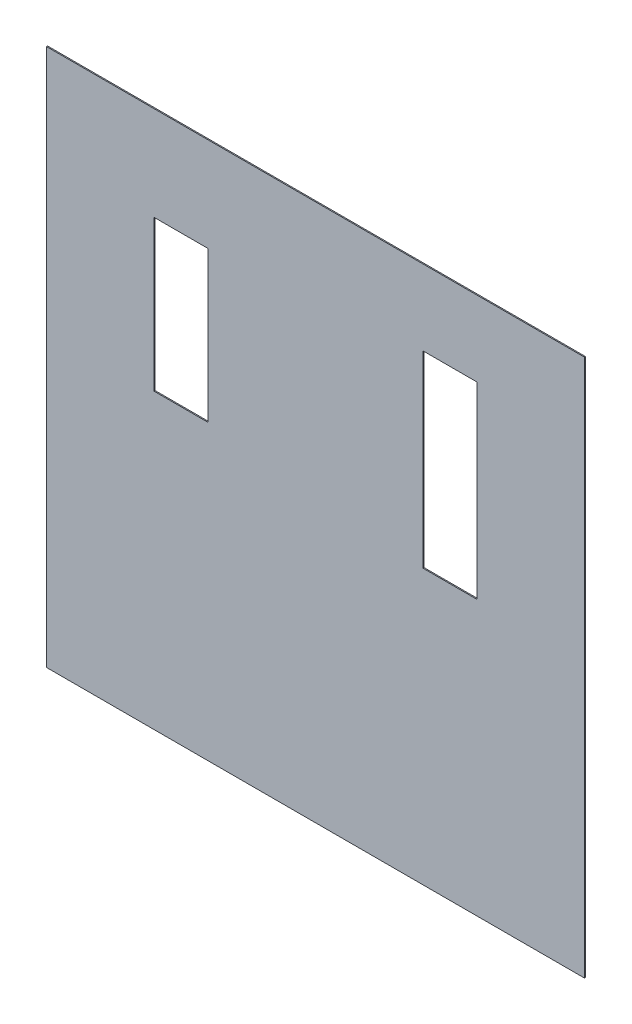
ISO-10303-21;
HEADER;
FILE_DESCRIPTION(('STEP AP214'),'2;1');
FILE_NAME('part.step','',(''),(''),'','','');
FILE_SCHEMA(('AUTOMOTIVE_DESIGN { 1 0 10303 214 1 1 1 1 }'));
ENDSEC;
DATA;
#1=APPLICATION_CONTEXT('core data for automotive mechanical design processes');
#2=APPLICATION_PROTOCOL_DEFINITION('international standard','automotive_design',2000,#1);
#3=PRODUCT_CONTEXT('',#1,'mechanical');
#4=PRODUCT('Part','Part','',(#3));
#5=PRODUCT_RELATED_PRODUCT_CATEGORY('part','',(#4));
#6=PRODUCT_DEFINITION_FORMATION('','',#4);
#7=PRODUCT_DEFINITION_CONTEXT('part definition',#1,'design');
#8=PRODUCT_DEFINITION('design','',#6,#7);
#9=PRODUCT_DEFINITION_SHAPE('','',#8);
#10=(LENGTH_UNIT() NAMED_UNIT(*) SI_UNIT(.MILLI.,.METRE.));
#11=(NAMED_UNIT(*) PLANE_ANGLE_UNIT() SI_UNIT($,.RADIAN.));
#12=(NAMED_UNIT(*) SI_UNIT($,.STERADIAN.) SOLID_ANGLE_UNIT());
#13=UNCERTAINTY_MEASURE_WITH_UNIT(LENGTH_MEASURE(1.E-05),#10,'distance_accuracy_value','');
#14=(GEOMETRIC_REPRESENTATION_CONTEXT(3) GLOBAL_UNCERTAINTY_ASSIGNED_CONTEXT((#13)) GLOBAL_UNIT_ASSIGNED_CONTEXT((#10,
#11,#12)) REPRESENTATION_CONTEXT('',''));
#15=CARTESIAN_POINT('',(0.,0.,0.));
#16=DIRECTION('',(0.,0.,1.));
#17=DIRECTION('',(1.,0.,0.));
#18=AXIS2_PLACEMENT_3D('',#15,#16,#17);
#19=CARTESIAN_POINT('',(0.,0.,0.0508));
#20=DIRECTION('',(1.,0.,0.));
#21=DIRECTION('',(0.,0.,-1.));
#22=AXIS2_PLACEMENT_3D('',#19,#20,#21);
#23=PLANE('',#22);
#24=DIRECTION('',(0.,-1.,0.));
#25=VECTOR('',#24,1.);
#26=CARTESIAN_POINT('',(0.,0.,0.));
#27=LINE('',#26,#25);
#28=CARTESIAN_POINT('',(0.,25.4,0.));
#29=VERTEX_POINT('',#28);
#30=CARTESIAN_POINT('',(0.,0.,0.));
#31=VERTEX_POINT('',#30);
#32=EDGE_CURVE('E183',#29,#31,#27,.T.);
#33=ORIENTED_EDGE('',*,*,#32,.T.);
#34=DIRECTION('',(0.,0.,-1.));
#35=VECTOR('',#34,1.);
#36=CARTESIAN_POINT('',(0.,0.,0.0508));
#37=LINE('',#36,#35);
#38=CARTESIAN_POINT('',(0.,0.,0.0508));
#39=VERTEX_POINT('',#38);
#40=EDGE_CURVE('E11',#39,#31,#37,.T.);
#41=ORIENTED_EDGE('',*,*,#40,.F.);
#42=DIRECTION('',(0.,-1.,0.));
#43=VECTOR('',#42,1.);
#44=CARTESIAN_POINT('',(0.,0.,0.0508));
#45=LINE('',#44,#43);
#46=CARTESIAN_POINT('',(0.,25.4,0.0508));
#47=VERTEX_POINT('',#46);
#48=EDGE_CURVE('E190',#47,#39,#45,.T.);
#49=ORIENTED_EDGE('',*,*,#48,.F.);
#50=DIRECTION('',(0.,0.,-1.));
#51=VECTOR('',#50,1.);
#52=CARTESIAN_POINT('',(0.,25.4,0.0508));
#53=LINE('',#52,#51);
#54=EDGE_CURVE('E200',#47,#29,#53,.T.);
#55=ORIENTED_EDGE('',*,*,#54,.T.);
#56=EDGE_LOOP('',(#33,#41,#49,#55));
#57=FACE_BOUND('',#56,.T.);
#58=ADVANCED_FACE('F33',(#57),#23,.F.);
#59=CARTESIAN_POINT('',(0.,0.,0.0508));
#60=DIRECTION('',(0.,1.,0.));
#61=DIRECTION('',(0.,0.,1.));
#62=AXIS2_PLACEMENT_3D('',#59,#60,#61);
#63=PLANE('',#62);
#64=DIRECTION('',(1.,0.,0.));
#65=VECTOR('',#64,1.);
#66=CARTESIAN_POINT('',(0.,0.,0.));
#67=LINE('',#66,#65);
#68=CARTESIAN_POINT('',(25.4,0.,0.));
#69=VERTEX_POINT('',#68);
#70=EDGE_CURVE('E203',#31,#69,#67,.T.);
#71=ORIENTED_EDGE('',*,*,#70,.T.);
#72=DIRECTION('',(0.,0.,-1.));
#73=VECTOR('',#72,1.);
#74=CARTESIAN_POINT('',(25.4,0.,0.0508));
#75=LINE('',#74,#73);
#76=CARTESIAN_POINT('',(25.4,0.,0.0508));
#77=VERTEX_POINT('',#76);
#78=EDGE_CURVE('E40',#77,#69,#75,.T.);
#79=ORIENTED_EDGE('',*,*,#78,.F.);
#80=DIRECTION('',(1.,0.,0.));
#81=VECTOR('',#80,1.);
#82=CARTESIAN_POINT('',(0.,0.,0.0508));
#83=LINE('',#82,#81);
#84=EDGE_CURVE('E193',#39,#77,#83,.T.);
#85=ORIENTED_EDGE('',*,*,#84,.F.);
#86=ORIENTED_EDGE('',*,*,#40,.T.);
#87=EDGE_LOOP('',(#71,#79,#85,#86));
#88=FACE_BOUND('',#87,.T.);
#89=ADVANCED_FACE('F232',(#88),#63,.F.);
#90=CARTESIAN_POINT('',(25.4,0.,0.0508));
#91=DIRECTION('',(-1.,0.,0.));
#92=DIRECTION('',(0.,0.,1.));
#93=AXIS2_PLACEMENT_3D('',#90,#91,#92);
#94=PLANE('',#93);
#95=DIRECTION('',(0.,1.,0.));
#96=VECTOR('',#95,1.);
#97=CARTESIAN_POINT('',(25.4,0.,0.));
#98=LINE('',#97,#96);
#99=CARTESIAN_POINT('',(25.4,25.4,0.));
#100=VERTEX_POINT('',#99);
#101=EDGE_CURVE('E205',#69,#100,#98,.T.);
#102=ORIENTED_EDGE('',*,*,#101,.T.);
#103=DIRECTION('',(0.,0.,-1.));
#104=VECTOR('',#103,1.);
#105=CARTESIAN_POINT('',(25.4,25.4,0.0508));
#106=LINE('',#105,#104);
#107=CARTESIAN_POINT('',(25.4,25.4,0.0508));
#108=VERTEX_POINT('',#107);
#109=EDGE_CURVE('E210',#108,#100,#106,.T.);
#110=ORIENTED_EDGE('',*,*,#109,.F.);
#111=DIRECTION('',(0.,1.,0.));
#112=VECTOR('',#111,1.);
#113=CARTESIAN_POINT('',(25.4,0.,0.0508));
#114=LINE('',#113,#112);
#115=EDGE_CURVE('E196',#77,#108,#114,.T.);
#116=ORIENTED_EDGE('',*,*,#115,.F.);
#117=ORIENTED_EDGE('',*,*,#78,.T.);
#118=EDGE_LOOP('',(#102,#110,#116,#117));
#119=FACE_BOUND('',#118,.T.);
#120=ADVANCED_FACE('F217',(#119),#94,.F.);
#121=CARTESIAN_POINT('',(0.,25.4,0.0508));
#122=DIRECTION('',(0.,-1.,0.));
#123=DIRECTION('',(0.,0.,-1.));
#124=AXIS2_PLACEMENT_3D('',#121,#122,#123);
#125=PLANE('',#124);
#126=DIRECTION('',(-1.,0.,0.));
#127=VECTOR('',#126,1.);
#128=CARTESIAN_POINT('',(0.,25.4,0.));
#129=LINE('',#128,#127);
#130=EDGE_CURVE('E194',#100,#29,#129,.T.);
#131=ORIENTED_EDGE('',*,*,#130,.T.);
#132=ORIENTED_EDGE('',*,*,#54,.F.);
#133=DIRECTION('',(-1.,0.,0.));
#134=VECTOR('',#133,1.);
#135=CARTESIAN_POINT('',(0.,25.4,0.0508));
#136=LINE('',#135,#134);
#137=EDGE_CURVE('E198',#108,#47,#136,.T.);
#138=ORIENTED_EDGE('',*,*,#137,.F.);
#139=ORIENTED_EDGE('',*,*,#109,.T.);
#140=EDGE_LOOP('',(#131,#132,#138,#139));
#141=FACE_BOUND('',#140,.T.);
#142=ADVANCED_FACE('F225',(#141),#125,.F.);
#143=CARTESIAN_POINT('',(0.,0.,0.0508));
#144=DIRECTION('',(0.,0.,-1.));
#145=DIRECTION('',(-1.,0.,0.));
#146=AXIS2_PLACEMENT_3D('',#143,#144,#145);
#147=PLANE('',#146);
#148=DIRECTION('',(1.,0.,0.));
#149=VECTOR('',#148,1.);
#150=CARTESIAN_POINT('',(17.78,12.954,0.0508));
#151=LINE('',#150,#149);
#152=CARTESIAN_POINT('',(17.78,12.954,0.0508));
#153=VERTEX_POINT('',#152);
#154=CARTESIAN_POINT('',(20.32,12.954,0.0508));
#155=VERTEX_POINT('',#154);
#156=EDGE_CURVE('E148',#153,#155,#151,.T.);
#157=ORIENTED_EDGE('',*,*,#156,.F.);
#158=DIRECTION('',(0.,-1.,0.));
#159=VECTOR('',#158,1.);
#160=CARTESIAN_POINT('',(17.78,21.844,0.0508));
#161=LINE('',#160,#159);
#162=CARTESIAN_POINT('',(17.78,21.844,0.0508));
#163=VERTEX_POINT('',#162);
#164=EDGE_CURVE('E47',#163,#153,#161,.T.);
#165=ORIENTED_EDGE('',*,*,#164,.F.);
#166=DIRECTION('',(-1.,0.,0.));
#167=VECTOR('',#166,1.);
#168=CARTESIAN_POINT('',(17.78,21.844,0.0508));
#169=LINE('',#168,#167);
#170=CARTESIAN_POINT('',(20.32,21.844,0.0508));
#171=VERTEX_POINT('',#170);
#172=EDGE_CURVE('E139',#171,#163,#169,.T.);
#173=ORIENTED_EDGE('',*,*,#172,.F.);
#174=DIRECTION('',(0.,1.,0.));
#175=VECTOR('',#174,1.);
#176=CARTESIAN_POINT('',(20.32,21.844,0.0508));
#177=LINE('',#176,#175);
#178=EDGE_CURVE('E142',#155,#171,#177,.T.);
#179=ORIENTED_EDGE('',*,*,#178,.F.);
#180=EDGE_LOOP('',(#157,#165,#173,#179));
#181=FACE_BOUND('',#180,.T.);
#182=DIRECTION('',(1.,0.,0.));
#183=VECTOR('',#182,1.);
#184=CARTESIAN_POINT('',(5.08,13.843,0.0508));
#185=LINE('',#184,#183);
#186=CARTESIAN_POINT('',(5.08,13.843,0.0508));
#187=VERTEX_POINT('',#186);
#188=CARTESIAN_POINT('',(7.62,13.843,0.0508));
#189=VERTEX_POINT('',#188);
#190=EDGE_CURVE('E173',#187,#189,#185,.T.);
#191=ORIENTED_EDGE('',*,*,#190,.F.);
#192=DIRECTION('',(0.,-1.,0.));
#193=VECTOR('',#192,1.);
#194=CARTESIAN_POINT('',(5.08,20.955,0.0508));
#195=LINE('',#194,#193);
#196=CARTESIAN_POINT('',(5.08,20.955,0.0508));
#197=VERTEX_POINT('',#196);
#198=EDGE_CURVE('E154',#197,#187,#195,.T.);
#199=ORIENTED_EDGE('',*,*,#198,.F.);
#200=DIRECTION('',(-1.,0.,0.));
#201=VECTOR('',#200,1.);
#202=CARTESIAN_POINT('',(5.08,20.955,0.0508));
#203=LINE('',#202,#201);
#204=CARTESIAN_POINT('',(7.62,20.955,0.0508));
#205=VERTEX_POINT('',#204);
#206=EDGE_CURVE('E162',#205,#197,#203,.T.);
#207=ORIENTED_EDGE('',*,*,#206,.F.);
#208=DIRECTION('',(0.,1.,0.));
#209=VECTOR('',#208,1.);
#210=CARTESIAN_POINT('',(7.62,20.955,0.0508));
#211=LINE('',#210,#209);
#212=EDGE_CURVE('E176',#189,#205,#211,.T.);
#213=ORIENTED_EDGE('',*,*,#212,.F.);
#214=EDGE_LOOP('',(#191,#199,#207,#213));
#215=FACE_BOUND('',#214,.T.);
#216=ORIENTED_EDGE('',*,*,#48,.T.);
#217=ORIENTED_EDGE('',*,*,#84,.T.);
#218=ORIENTED_EDGE('',*,*,#115,.T.);
#219=ORIENTED_EDGE('',*,*,#137,.T.);
#220=EDGE_LOOP('',(#216,#217,#218,#219));
#221=FACE_BOUND('',#220,.T.);
#222=ADVANCED_FACE('F231',(#181,#215,#221),#147,.F.);
#223=CARTESIAN_POINT('',(0.,0.,0.));
#224=DIRECTION('',(0.,0.,-1.));
#225=DIRECTION('',(-1.,0.,0.));
#226=AXIS2_PLACEMENT_3D('',#223,#224,#225);
#227=PLANE('',#226);
#228=DIRECTION('',(0.,-1.,0.));
#229=VECTOR('',#228,1.);
#230=CARTESIAN_POINT('',(17.78,21.844,0.));
#231=LINE('',#230,#229);
#232=CARTESIAN_POINT('',(17.78,21.844,0.));
#233=VERTEX_POINT('',#232);
#234=CARTESIAN_POINT('',(17.78,12.954,0.));
#235=VERTEX_POINT('',#234);
#236=EDGE_CURVE('E123',#233,#235,#231,.T.);
#237=ORIENTED_EDGE('',*,*,#236,.T.);
#238=DIRECTION('',(1.,0.,0.));
#239=VECTOR('',#238,1.);
#240=CARTESIAN_POINT('',(17.78,12.954,0.));
#241=LINE('',#240,#239);
#242=CARTESIAN_POINT('',(20.32,12.954,0.));
#243=VERTEX_POINT('',#242);
#244=EDGE_CURVE('E132',#235,#243,#241,.T.);
#245=ORIENTED_EDGE('',*,*,#244,.T.);
#246=DIRECTION('',(0.,1.,0.));
#247=VECTOR('',#246,1.);
#248=CARTESIAN_POINT('',(20.32,21.844,0.));
#249=LINE('',#248,#247);
#250=CARTESIAN_POINT('',(20.32,21.844,0.));
#251=VERTEX_POINT('',#250);
#252=EDGE_CURVE('E55',#243,#251,#249,.T.);
#253=ORIENTED_EDGE('',*,*,#252,.T.);
#254=DIRECTION('',(-1.,0.,0.));
#255=VECTOR('',#254,1.);
#256=CARTESIAN_POINT('',(17.78,21.844,0.));
#257=LINE('',#256,#255);
#258=EDGE_CURVE('E129',#251,#233,#257,.T.);
#259=ORIENTED_EDGE('',*,*,#258,.T.);
#260=EDGE_LOOP('',(#237,#245,#253,#259));
#261=FACE_BOUND('',#260,.T.);
#262=DIRECTION('',(0.,-1.,0.));
#263=VECTOR('',#262,1.);
#264=CARTESIAN_POINT('',(5.08,20.955,0.));
#265=LINE('',#264,#263);
#266=CARTESIAN_POINT('',(5.08,20.955,0.));
#267=VERTEX_POINT('',#266);
#268=CARTESIAN_POINT('',(5.08,13.843,0.));
#269=VERTEX_POINT('',#268);
#270=EDGE_CURVE('E158',#267,#269,#265,.T.);
#271=ORIENTED_EDGE('',*,*,#270,.T.);
#272=DIRECTION('',(1.,0.,0.));
#273=VECTOR('',#272,1.);
#274=CARTESIAN_POINT('',(5.08,13.843,0.));
#275=LINE('',#274,#273);
#276=CARTESIAN_POINT('',(7.62,13.843,0.));
#277=VERTEX_POINT('',#276);
#278=EDGE_CURVE('E161',#269,#277,#275,.T.);
#279=ORIENTED_EDGE('',*,*,#278,.T.);
#280=DIRECTION('',(0.,1.,0.));
#281=VECTOR('',#280,1.);
#282=CARTESIAN_POINT('',(7.62,20.955,0.));
#283=LINE('',#282,#281);
#284=CARTESIAN_POINT('',(7.62,20.955,0.));
#285=VERTEX_POINT('',#284);
#286=EDGE_CURVE('E165',#277,#285,#283,.T.);
#287=ORIENTED_EDGE('',*,*,#286,.T.);
#288=DIRECTION('',(-1.,0.,0.));
#289=VECTOR('',#288,1.);
#290=CARTESIAN_POINT('',(5.08,20.955,0.));
#291=LINE('',#290,#289);
#292=EDGE_CURVE('E168',#285,#267,#291,.T.);
#293=ORIENTED_EDGE('',*,*,#292,.T.);
#294=EDGE_LOOP('',(#271,#279,#287,#293));
#295=FACE_BOUND('',#294,.T.);
#296=ORIENTED_EDGE('',*,*,#32,.F.);
#297=ORIENTED_EDGE('',*,*,#130,.F.);
#298=ORIENTED_EDGE('',*,*,#101,.F.);
#299=ORIENTED_EDGE('',*,*,#70,.F.);
#300=EDGE_LOOP('',(#296,#297,#298,#299));
#301=FACE_BOUND('',#300,.T.);
#302=ADVANCED_FACE('F136',(#261,#295,#301),#227,.T.);
#303=CARTESIAN_POINT('',(5.08,20.955,0.));
#304=DIRECTION('',(-1.,0.,0.));
#305=DIRECTION('',(0.,0.,1.));
#306=AXIS2_PLACEMENT_3D('',#303,#304,#305);
#307=PLANE('',#306);
#308=ORIENTED_EDGE('',*,*,#198,.T.);
#309=DIRECTION('',(0.,0.,1.));
#310=VECTOR('',#309,1.);
#311=CARTESIAN_POINT('',(5.08,13.843,0.));
#312=LINE('',#311,#310);
#313=EDGE_CURVE('E171',#269,#187,#312,.T.);
#314=ORIENTED_EDGE('',*,*,#313,.F.);
#315=ORIENTED_EDGE('',*,*,#270,.F.);
#316=DIRECTION('',(0.,0.,1.));
#317=VECTOR('',#316,1.);
#318=CARTESIAN_POINT('',(5.08,20.955,0.));
#319=LINE('',#318,#317);
#320=EDGE_CURVE('E181',#267,#197,#319,.T.);
#321=ORIENTED_EDGE('',*,*,#320,.T.);
#322=EDGE_LOOP('',(#308,#314,#315,#321));
#323=FACE_BOUND('',#322,.T.);
#324=ADVANCED_FACE('F244',(#323),#307,.F.);
#325=CARTESIAN_POINT('',(5.08,20.955,0.));
#326=DIRECTION('',(0.,1.,0.));
#327=DIRECTION('',(0.,0.,1.));
#328=AXIS2_PLACEMENT_3D('',#325,#326,#327);
#329=PLANE('',#328);
#330=ORIENTED_EDGE('',*,*,#206,.T.);
#331=ORIENTED_EDGE('',*,*,#320,.F.);
#332=ORIENTED_EDGE('',*,*,#292,.F.);
#333=DIRECTION('',(0.,0.,1.));
#334=VECTOR('',#333,1.);
#335=CARTESIAN_POINT('',(7.62,20.955,0.));
#336=LINE('',#335,#334);
#337=EDGE_CURVE('E184',#285,#205,#336,.T.);
#338=ORIENTED_EDGE('',*,*,#337,.T.);
#339=EDGE_LOOP('',(#330,#331,#332,#338));
#340=FACE_BOUND('',#339,.T.);
#341=ADVANCED_FACE('F250',(#340),#329,.F.);
#342=CARTESIAN_POINT('',(7.62,20.955,0.));
#343=DIRECTION('',(1.,0.,0.));
#344=DIRECTION('',(0.,1.,0.));
#345=AXIS2_PLACEMENT_3D('',#342,#343,#344);
#346=PLANE('',#345);
#347=ORIENTED_EDGE('',*,*,#212,.T.);
#348=ORIENTED_EDGE('',*,*,#337,.F.);
#349=ORIENTED_EDGE('',*,*,#286,.F.);
#350=DIRECTION('',(0.,0.,1.));
#351=VECTOR('',#350,1.);
#352=CARTESIAN_POINT('',(7.62,13.843,0.));
#353=LINE('',#352,#351);
#354=EDGE_CURVE('E186',#277,#189,#353,.T.);
#355=ORIENTED_EDGE('',*,*,#354,.T.);
#356=EDGE_LOOP('',(#347,#348,#349,#355));
#357=FACE_BOUND('',#356,.T.);
#358=ADVANCED_FACE('F255',(#357),#346,.F.);
#359=CARTESIAN_POINT('',(5.08,13.843,0.));
#360=DIRECTION('',(0.,-1.,0.));
#361=DIRECTION('',(0.,0.,-1.));
#362=AXIS2_PLACEMENT_3D('',#359,#360,#361);
#363=PLANE('',#362);
#364=ORIENTED_EDGE('',*,*,#190,.T.);
#365=ORIENTED_EDGE('',*,*,#354,.F.);
#366=ORIENTED_EDGE('',*,*,#278,.F.);
#367=ORIENTED_EDGE('',*,*,#313,.T.);
#368=EDGE_LOOP('',(#364,#365,#366,#367));
#369=FACE_BOUND('',#368,.T.);
#370=ADVANCED_FACE('F252',(#369),#363,.F.);
#371=CARTESIAN_POINT('',(17.78,21.844,0.));
#372=DIRECTION('',(-1.,0.,0.));
#373=DIRECTION('',(0.,-1.,0.));
#374=AXIS2_PLACEMENT_3D('',#371,#372,#373);
#375=PLANE('',#374);
#376=ORIENTED_EDGE('',*,*,#164,.T.);
#377=DIRECTION('',(0.,0.,1.));
#378=VECTOR('',#377,1.);
#379=CARTESIAN_POINT('',(17.78,12.954,0.));
#380=LINE('',#379,#378);
#381=EDGE_CURVE('E119',#235,#153,#380,.T.);
#382=ORIENTED_EDGE('',*,*,#381,.F.);
#383=ORIENTED_EDGE('',*,*,#236,.F.);
#384=DIRECTION('',(0.,0.,1.));
#385=VECTOR('',#384,1.);
#386=CARTESIAN_POINT('',(17.78,21.844,0.));
#387=LINE('',#386,#385);
#388=EDGE_CURVE('E152',#233,#163,#387,.T.);
#389=ORIENTED_EDGE('',*,*,#388,.T.);
#390=EDGE_LOOP('',(#376,#382,#383,#389));
#391=FACE_BOUND('',#390,.T.);
#392=ADVANCED_FACE('F121',(#391),#375,.F.);
#393=CARTESIAN_POINT('',(17.78,21.844,0.));
#394=DIRECTION('',(0.,1.,0.));
#395=DIRECTION('',(-1.,0.,0.));
#396=AXIS2_PLACEMENT_3D('',#393,#394,#395);
#397=PLANE('',#396);
#398=ORIENTED_EDGE('',*,*,#172,.T.);
#399=ORIENTED_EDGE('',*,*,#388,.F.);
#400=ORIENTED_EDGE('',*,*,#258,.F.);
#401=DIRECTION('',(0.,0.,1.));
#402=VECTOR('',#401,1.);
#403=CARTESIAN_POINT('',(20.32,21.844,0.));
#404=LINE('',#403,#402);
#405=EDGE_CURVE('E155',#251,#171,#404,.T.);
#406=ORIENTED_EDGE('',*,*,#405,.T.);
#407=EDGE_LOOP('',(#398,#399,#400,#406));
#408=FACE_BOUND('',#407,.T.);
#409=ADVANCED_FACE('F265',(#408),#397,.F.);
#410=CARTESIAN_POINT('',(20.32,21.844,0.));
#411=DIRECTION('',(1.,0.,0.));
#412=DIRECTION('',(0.,0.,-1.));
#413=AXIS2_PLACEMENT_3D('',#410,#411,#412);
#414=PLANE('',#413);
#415=ORIENTED_EDGE('',*,*,#178,.T.);
#416=ORIENTED_EDGE('',*,*,#405,.F.);
#417=ORIENTED_EDGE('',*,*,#252,.F.);
#418=DIRECTION('',(0.,0.,1.));
#419=VECTOR('',#418,1.);
#420=CARTESIAN_POINT('',(20.32,12.954,0.));
#421=LINE('',#420,#419);
#422=EDGE_CURVE('E128',#243,#155,#421,.T.);
#423=ORIENTED_EDGE('',*,*,#422,.T.);
#424=EDGE_LOOP('',(#415,#416,#417,#423));
#425=FACE_BOUND('',#424,.T.);
#426=ADVANCED_FACE('F268',(#425),#414,.F.);
#427=CARTESIAN_POINT('',(17.78,12.954,0.));
#428=DIRECTION('',(0.,-1.,0.));
#429=DIRECTION('',(0.,0.,-1.));
#430=AXIS2_PLACEMENT_3D('',#427,#428,#429);
#431=PLANE('',#430);
#432=ORIENTED_EDGE('',*,*,#156,.T.);
#433=ORIENTED_EDGE('',*,*,#422,.F.);
#434=ORIENTED_EDGE('',*,*,#244,.F.);
#435=ORIENTED_EDGE('',*,*,#381,.T.);
#436=EDGE_LOOP('',(#432,#433,#434,#435));
#437=FACE_BOUND('',#436,.T.);
#438=ADVANCED_FACE('F133',(#437),#431,.F.);
#439=CLOSED_SHELL('',(#58,#89,#120,#142,#222,#302,#324,#341,#358,#370,#392,#409,#426,#438));
#440=MANIFOLD_SOLID_BREP('B2',#439);
#441=ADVANCED_BREP_SHAPE_REPRESENTATION('',(#18,#440),#14);
#442=SHAPE_DEFINITION_REPRESENTATION(#9,#441);
ENDSEC;
END-ISO-10303-21;
